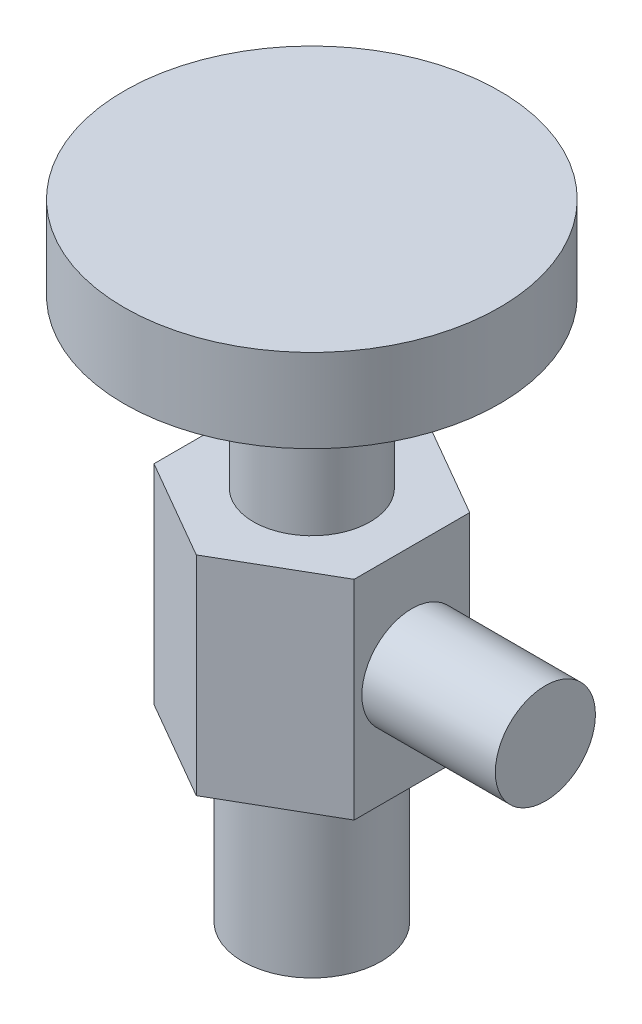
ISO-10303-21;
HEADER;
FILE_DESCRIPTION(('STEP AP214'),'2;1');
FILE_NAME('part.step','',(''),(''),'','','');
FILE_SCHEMA(('AUTOMOTIVE_DESIGN { 1 0 10303 214 1 1 1 1 }'));
ENDSEC;
DATA;
#1=APPLICATION_CONTEXT('core data for automotive mechanical design processes');
#2=APPLICATION_PROTOCOL_DEFINITION('international standard','automotive_design',2000,#1);
#3=PRODUCT_CONTEXT('',#1,'mechanical');
#4=PRODUCT('Part','Part','',(#3));
#5=PRODUCT_RELATED_PRODUCT_CATEGORY('part','',(#4));
#6=PRODUCT_DEFINITION_FORMATION('','',#4);
#7=PRODUCT_DEFINITION_CONTEXT('part definition',#1,'design');
#8=PRODUCT_DEFINITION('design','',#6,#7);
#9=PRODUCT_DEFINITION_SHAPE('','',#8);
#10=(LENGTH_UNIT() NAMED_UNIT(*) SI_UNIT(.MILLI.,.METRE.));
#11=(NAMED_UNIT(*) PLANE_ANGLE_UNIT() SI_UNIT($,.RADIAN.));
#12=(NAMED_UNIT(*) SI_UNIT($,.STERADIAN.) SOLID_ANGLE_UNIT());
#13=UNCERTAINTY_MEASURE_WITH_UNIT(LENGTH_MEASURE(1.E-05),#10,'distance_accuracy_value','');
#14=(GEOMETRIC_REPRESENTATION_CONTEXT(3) GLOBAL_UNCERTAINTY_ASSIGNED_CONTEXT((#13)) GLOBAL_UNIT_ASSIGNED_CONTEXT((#10,
#11,#12)) REPRESENTATION_CONTEXT('',''));
#15=CARTESIAN_POINT('',(0.,0.,0.));
#16=DIRECTION('',(0.,0.,1.));
#17=DIRECTION('',(1.,0.,0.));
#18=AXIS2_PLACEMENT_3D('',#15,#16,#17);
#19=CARTESIAN_POINT('',(0.,-20.,0.));
#20=DIRECTION('',(0.,1.,0.));
#21=DIRECTION('',(0.,0.,1.));
#22=AXIS2_PLACEMENT_3D('',#19,#20,#21);
#23=CYLINDRICAL_SURFACE('',#22,8.3);
#24=CARTESIAN_POINT('',(0.,-20.,0.));
#25=DIRECTION('',(0.,1.,0.));
#26=DIRECTION('',(0.,0.,1.));
#27=AXIS2_PLACEMENT_3D('',#24,#25,#26);
#28=CIRCLE('',#27,8.3);
#29=CARTESIAN_POINT('',(0.,-20.,8.3));
#30=VERTEX_POINT('',#29);
#31=EDGE_CURVE('E144',#30,#30,#28,.T.);
#32=ORIENTED_EDGE('',*,*,#31,.T.);
#33=EDGE_LOOP('',(#32));
#34=FACE_BOUND('',#33,.T.);
#35=CARTESIAN_POINT('',(0.,0.,0.));
#36=DIRECTION('',(0.,1.,0.));
#37=DIRECTION('',(0.,0.,1.));
#38=AXIS2_PLACEMENT_3D('',#35,#36,#37);
#39=CIRCLE('',#38,8.3);
#40=CARTESIAN_POINT('',(0.,0.,8.3));
#41=VERTEX_POINT('',#40);
#42=EDGE_CURVE('E145',#41,#41,#39,.T.);
#43=ORIENTED_EDGE('',*,*,#42,.F.);
#44=EDGE_LOOP('',(#43));
#45=FACE_BOUND('',#44,.T.);
#46=ADVANCED_FACE('F39',(#34,#45),#23,.T.);
#47=CARTESIAN_POINT('',(0.,-20.,0.));
#48=DIRECTION('',(0.,1.,0.));
#49=DIRECTION('',(0.,0.,1.));
#50=AXIS2_PLACEMENT_3D('',#47,#48,#49);
#51=PLANE('',#50);
#52=ORIENTED_EDGE('',*,*,#31,.F.);
#53=EDGE_LOOP('',(#52));
#54=FACE_BOUND('',#53,.T.);
#55=ADVANCED_FACE('F152',(#54),#51,.F.);
#56=CARTESIAN_POINT('',(11.9999999999999,25.,-6.92820323027565));
#57=DIRECTION('',(-0.499999999999995,0.,0.866025403784442));
#58=DIRECTION('',(0.866025403784442,0.,0.499999999999995));
#59=AXIS2_PLACEMENT_3D('',#56,#57,#58);
#60=PLANE('',#59);
#61=DIRECTION('',(-0.866025403784442,0.,-0.499999999999995));
#62=VECTOR('',#61,1.);
#63=CARTESIAN_POINT('',(11.9999999999999,0.,-6.92820323027565));
#64=LINE('',#63,#62);
#65=CARTESIAN_POINT('',(11.9999999999999,0.,-6.92820323027565));
#66=VERTEX_POINT('',#65);
#67=CARTESIAN_POINT('',(0.,0.,-13.856406460551));
#68=VERTEX_POINT('',#67);
#69=EDGE_CURVE('E121',#66,#68,#64,.T.);
#70=ORIENTED_EDGE('',*,*,#69,.T.);
#71=DIRECTION('',(0.,-1.,0.));
#72=VECTOR('',#71,1.);
#73=CARTESIAN_POINT('',(0.,25.,-13.856406460551));
#74=LINE('',#73,#72);
#75=CARTESIAN_POINT('',(0.,25.,-13.856406460551));
#76=VERTEX_POINT('',#75);
#77=EDGE_CURVE('E142',#76,#68,#74,.T.);
#78=ORIENTED_EDGE('',*,*,#77,.F.);
#79=DIRECTION('',(-0.866025403784442,0.,-0.499999999999995));
#80=VECTOR('',#79,1.);
#81=CARTESIAN_POINT('',(11.9999999999999,25.,-6.92820323027565));
#82=LINE('',#81,#80);
#83=CARTESIAN_POINT('',(11.9999999999999,25.,-6.92820323027565));
#84=VERTEX_POINT('',#83);
#85=EDGE_CURVE('E133',#84,#76,#82,.T.);
#86=ORIENTED_EDGE('',*,*,#85,.F.);
#87=DIRECTION('',(0.,-1.,0.));
#88=VECTOR('',#87,1.);
#89=CARTESIAN_POINT('',(11.9999999999999,25.,-6.92820323027565));
#90=LINE('',#89,#88);
#91=EDGE_CURVE('E118',#84,#66,#90,.T.);
#92=ORIENTED_EDGE('',*,*,#91,.T.);
#93=EDGE_LOOP('',(#70,#78,#86,#92));
#94=FACE_BOUND('',#93,.T.);
#95=ADVANCED_FACE('F157',(#94),#60,.F.);
#96=CARTESIAN_POINT('',(0.,25.,-13.856406460551));
#97=DIRECTION('',(0.500000000000001,0.,0.866025403784438));
#98=DIRECTION('',(0.866025403784438,0.,-0.500000000000001));
#99=AXIS2_PLACEMENT_3D('',#96,#97,#98);
#100=PLANE('',#99);
#101=DIRECTION('',(-0.866025403784438,0.,0.500000000000001));
#102=VECTOR('',#101,1.);
#103=CARTESIAN_POINT('',(0.,0.,-13.856406460551));
#104=LINE('',#103,#102);
#105=CARTESIAN_POINT('',(-12.,0.,-6.92820323027548));
#106=VERTEX_POINT('',#105);
#107=EDGE_CURVE('E130',#68,#106,#104,.T.);
#108=ORIENTED_EDGE('',*,*,#107,.T.);
#109=DIRECTION('',(0.,-1.,0.));
#110=VECTOR('',#109,1.);
#111=CARTESIAN_POINT('',(-12.,25.,-6.92820323027548));
#112=LINE('',#111,#110);
#113=CARTESIAN_POINT('',(-12.,25.,-6.92820323027548));
#114=VERTEX_POINT('',#113);
#115=EDGE_CURVE('E136',#114,#106,#112,.T.);
#116=ORIENTED_EDGE('',*,*,#115,.F.);
#117=DIRECTION('',(-0.866025403784438,0.,0.500000000000001));
#118=VECTOR('',#117,1.);
#119=CARTESIAN_POINT('',(0.,25.,-13.856406460551));
#120=LINE('',#119,#118);
#121=EDGE_CURVE('E91',#76,#114,#120,.T.);
#122=ORIENTED_EDGE('',*,*,#121,.F.);
#123=ORIENTED_EDGE('',*,*,#77,.T.);
#124=EDGE_LOOP('',(#108,#116,#122,#123));
#125=FACE_BOUND('',#124,.T.);
#126=ADVANCED_FACE('F164',(#125),#100,.F.);
#127=CARTESIAN_POINT('',(-12.,25.,-6.92820323027548));
#128=DIRECTION('',(1.,0.,0.));
#129=DIRECTION('',(0.,0.,-1.));
#130=AXIS2_PLACEMENT_3D('',#127,#128,#129);
#131=PLANE('',#130);
#132=DIRECTION('',(0.,0.,1.));
#133=VECTOR('',#132,1.);
#134=CARTESIAN_POINT('',(-12.,0.,-6.92820323027548));
#135=LINE('',#134,#133);
#136=CARTESIAN_POINT('',(-12.,0.,6.92820323027556));
#137=VERTEX_POINT('',#136);
#138=EDGE_CURVE('E128',#106,#137,#135,.T.);
#139=ORIENTED_EDGE('',*,*,#138,.T.);
#140=DIRECTION('',(0.,-1.,0.));
#141=VECTOR('',#140,1.);
#142=CARTESIAN_POINT('',(-12.,25.,6.92820323027556));
#143=LINE('',#142,#141);
#144=CARTESIAN_POINT('',(-12.,25.,6.92820323027556));
#145=VERTEX_POINT('',#144);
#146=EDGE_CURVE('E113',#145,#137,#143,.T.);
#147=ORIENTED_EDGE('',*,*,#146,.F.);
#148=DIRECTION('',(0.,0.,1.));
#149=VECTOR('',#148,1.);
#150=CARTESIAN_POINT('',(-12.,25.,-6.92820323027548));
#151=LINE('',#150,#149);
#152=EDGE_CURVE('E106',#114,#145,#151,.T.);
#153=ORIENTED_EDGE('',*,*,#152,.F.);
#154=ORIENTED_EDGE('',*,*,#115,.T.);
#155=EDGE_LOOP('',(#139,#147,#153,#154));
#156=FACE_BOUND('',#155,.T.);
#157=ADVANCED_FACE('F172',(#156),#131,.F.);
#158=CARTESIAN_POINT('',(-12.,25.,6.92820323027556));
#159=DIRECTION('',(0.499999999999995,0.,-0.866025403784442));
#160=DIRECTION('',(-0.866025403784442,0.,-0.499999999999995));
#161=AXIS2_PLACEMENT_3D('',#158,#159,#160);
#162=PLANE('',#161);
#163=DIRECTION('',(0.866025403784442,0.,0.499999999999995));
#164=VECTOR('',#163,1.);
#165=CARTESIAN_POINT('',(-12.,0.,6.92820323027556));
#166=LINE('',#165,#164);
#167=CARTESIAN_POINT('',(0.,0.,13.856406460551));
#168=VERTEX_POINT('',#167);
#169=EDGE_CURVE('E111',#137,#168,#166,.T.);
#170=ORIENTED_EDGE('',*,*,#169,.T.);
#171=DIRECTION('',(0.,-1.,0.));
#172=VECTOR('',#171,1.);
#173=CARTESIAN_POINT('',(0.,25.,13.856406460551));
#174=LINE('',#173,#172);
#175=CARTESIAN_POINT('',(0.,25.,13.856406460551));
#176=VERTEX_POINT('',#175);
#177=EDGE_CURVE('E112',#176,#168,#174,.T.);
#178=ORIENTED_EDGE('',*,*,#177,.F.);
#179=DIRECTION('',(0.866025403784442,0.,0.499999999999995));
#180=VECTOR('',#179,1.);
#181=CARTESIAN_POINT('',(-12.,25.,6.92820323027556));
#182=LINE('',#181,#180);
#183=EDGE_CURVE('E99',#145,#176,#182,.T.);
#184=ORIENTED_EDGE('',*,*,#183,.F.);
#185=ORIENTED_EDGE('',*,*,#146,.T.);
#186=EDGE_LOOP('',(#170,#178,#184,#185));
#187=FACE_BOUND('',#186,.T.);
#188=ADVANCED_FACE('F115',(#187),#162,.F.);
#189=CARTESIAN_POINT('',(0.,25.,13.856406460551));
#190=DIRECTION('',(-0.500000000000007,0.,-0.866025403784434));
#191=DIRECTION('',(-0.866025403784435,0.,0.500000000000007));
#192=AXIS2_PLACEMENT_3D('',#189,#190,#191);
#193=PLANE('',#192);
#194=DIRECTION('',(0.866025403784434,0.,-0.500000000000007));
#195=VECTOR('',#194,1.);
#196=CARTESIAN_POINT('',(0.,0.,13.856406460551));
#197=LINE('',#196,#195);
#198=CARTESIAN_POINT('',(12.0000000000001,0.,6.9282032302754));
#199=VERTEX_POINT('',#198);
#200=EDGE_CURVE('E79',#168,#199,#197,.T.);
#201=ORIENTED_EDGE('',*,*,#200,.T.);
#202=DIRECTION('',(0.,-1.,0.));
#203=VECTOR('',#202,1.);
#204=CARTESIAN_POINT('',(12.0000000000001,25.,6.9282032302754));
#205=LINE('',#204,#203);
#206=CARTESIAN_POINT('',(12.0000000000001,25.,6.9282032302754));
#207=VERTEX_POINT('',#206);
#208=EDGE_CURVE('E117',#207,#199,#205,.T.);
#209=ORIENTED_EDGE('',*,*,#208,.F.);
#210=DIRECTION('',(0.866025403784434,0.,-0.500000000000007));
#211=VECTOR('',#210,1.);
#212=CARTESIAN_POINT('',(0.,25.,13.856406460551));
#213=LINE('',#212,#211);
#214=EDGE_CURVE('E102',#176,#207,#213,.T.);
#215=ORIENTED_EDGE('',*,*,#214,.F.);
#216=ORIENTED_EDGE('',*,*,#177,.T.);
#217=EDGE_LOOP('',(#201,#209,#215,#216));
#218=FACE_BOUND('',#217,.T.);
#219=ADVANCED_FACE('F119',(#218),#193,.F.);
#220=CARTESIAN_POINT('',(12.0000000000001,25.,6.9282032302754));
#221=DIRECTION('',(-1.,0.,0.));
#222=DIRECTION('',(0.,0.,1.));
#223=AXIS2_PLACEMENT_3D('',#220,#221,#222);
#224=PLANE('',#223);
#225=CARTESIAN_POINT('',(12.,12.5,0.));
#226=DIRECTION('',(-1.,0.,0.));
#227=DIRECTION('',(0.,0.,1.));
#228=AXIS2_PLACEMENT_3D('',#225,#226,#227);
#229=CIRCLE('',#228,6.);
#230=CARTESIAN_POINT('',(12.0000000000001,12.5,6.));
#231=VERTEX_POINT('',#230);
#232=EDGE_CURVE('E11',#231,#231,#229,.F.);
#233=ORIENTED_EDGE('',*,*,#232,.F.);
#234=EDGE_LOOP('',(#233));
#235=FACE_BOUND('',#234,.T.);
#236=DIRECTION('',(0.,0.,-1.));
#237=VECTOR('',#236,1.);
#238=CARTESIAN_POINT('',(12.0000000000001,0.,6.9282032302754));
#239=LINE('',#238,#237);
#240=EDGE_CURVE('E81',#199,#66,#239,.T.);
#241=ORIENTED_EDGE('',*,*,#240,.T.);
#242=ORIENTED_EDGE('',*,*,#91,.F.);
#243=DIRECTION('',(0.,0.,-1.));
#244=VECTOR('',#243,1.);
#245=CARTESIAN_POINT('',(12.0000000000001,25.,6.9282032302754));
#246=LINE('',#245,#244);
#247=EDGE_CURVE('E54',#207,#84,#246,.T.);
#248=ORIENTED_EDGE('',*,*,#247,.F.);
#249=ORIENTED_EDGE('',*,*,#208,.T.);
#250=EDGE_LOOP('',(#241,#242,#248,#249));
#251=FACE_BOUND('',#250,.T.);
#252=ADVANCED_FACE('F176',(#235,#251),#224,.F.);
#253=CARTESIAN_POINT('',(0.,25.,0.));
#254=DIRECTION('',(0.,1.,0.));
#255=DIRECTION('',(0.,0.,1.));
#256=AXIS2_PLACEMENT_3D('',#253,#254,#255);
#257=PLANE('',#256);
#258=CARTESIAN_POINT('',(0.,25.,0.));
#259=DIRECTION('',(0.,1.,0.));
#260=DIRECTION('',(0.,0.,1.));
#261=AXIS2_PLACEMENT_3D('',#258,#259,#260);
#262=CIRCLE('',#261,7.);
#263=CARTESIAN_POINT('',(0.,25.,7.));
#264=VERTEX_POINT('',#263);
#265=EDGE_CURVE('E50',#264,#264,#262,.T.);
#266=ORIENTED_EDGE('',*,*,#265,.F.);
#267=EDGE_LOOP('',(#266));
#268=FACE_BOUND('',#267,.T.);
#269=ORIENTED_EDGE('',*,*,#85,.T.);
#270=ORIENTED_EDGE('',*,*,#121,.T.);
#271=ORIENTED_EDGE('',*,*,#152,.T.);
#272=ORIENTED_EDGE('',*,*,#183,.T.);
#273=ORIENTED_EDGE('',*,*,#214,.T.);
#274=ORIENTED_EDGE('',*,*,#247,.T.);
#275=EDGE_LOOP('',(#269,#270,#271,#272,#273,#274));
#276=FACE_BOUND('',#275,.T.);
#277=ADVANCED_FACE('F105',(#268,#276),#257,.T.);
#278=CARTESIAN_POINT('',(0.,0.,0.));
#279=DIRECTION('',(0.,1.,0.));
#280=DIRECTION('',(0.,0.,1.));
#281=AXIS2_PLACEMENT_3D('',#278,#279,#280);
#282=PLANE('',#281);
#283=ORIENTED_EDGE('',*,*,#42,.T.);
#284=EDGE_LOOP('',(#283));
#285=FACE_BOUND('',#284,.T.);
#286=ORIENTED_EDGE('',*,*,#69,.F.);
#287=ORIENTED_EDGE('',*,*,#240,.F.);
#288=ORIENTED_EDGE('',*,*,#200,.F.);
#289=ORIENTED_EDGE('',*,*,#169,.F.);
#290=ORIENTED_EDGE('',*,*,#138,.F.);
#291=ORIENTED_EDGE('',*,*,#107,.F.);
#292=EDGE_LOOP('',(#286,#287,#288,#289,#290,#291));
#293=FACE_BOUND('',#292,.T.);
#294=ADVANCED_FACE('F147',(#285,#293),#282,.F.);
#295=CARTESIAN_POINT('',(0.,45.,0.));
#296=DIRECTION('',(0.,-1.,0.));
#297=DIRECTION('',(0.,0.,-1.));
#298=AXIS2_PLACEMENT_3D('',#295,#296,#297);
#299=CYLINDRICAL_SURFACE('',#298,7.);
#300=CARTESIAN_POINT('',(0.,45.,0.));
#301=DIRECTION('',(0.,1.,0.));
#302=DIRECTION('',(0.,0.,1.));
#303=AXIS2_PLACEMENT_3D('',#300,#301,#302);
#304=CIRCLE('',#303,7.);
#305=CARTESIAN_POINT('',(0.,45.,7.));
#306=VERTEX_POINT('',#305);
#307=EDGE_CURVE('E126',#306,#306,#304,.T.);
#308=ORIENTED_EDGE('',*,*,#307,.F.);
#309=EDGE_LOOP('',(#308));
#310=FACE_BOUND('',#309,.T.);
#311=ORIENTED_EDGE('',*,*,#265,.T.);
#312=EDGE_LOOP('',(#311));
#313=FACE_BOUND('',#312,.T.);
#314=ADVANCED_FACE('F183',(#310,#313),#299,.T.);
#315=CARTESIAN_POINT('',(0.,55.,0.));
#316=DIRECTION('',(0.,-1.,0.));
#317=DIRECTION('',(0.,0.,-1.));
#318=AXIS2_PLACEMENT_3D('',#315,#316,#317);
#319=CYLINDRICAL_SURFACE('',#318,22.5);
#320=CARTESIAN_POINT('',(0.,55.,0.));
#321=DIRECTION('',(0.,1.,0.));
#322=DIRECTION('',(0.,0.,1.));
#323=AXIS2_PLACEMENT_3D('',#320,#321,#322);
#324=CIRCLE('',#323,22.5);
#325=CARTESIAN_POINT('',(0.,55.,22.5));
#326=VERTEX_POINT('',#325);
#327=EDGE_CURVE('E218',#326,#326,#324,.T.);
#328=ORIENTED_EDGE('',*,*,#327,.F.);
#329=EDGE_LOOP('',(#328));
#330=FACE_BOUND('',#329,.T.);
#331=CARTESIAN_POINT('',(0.,45.,0.));
#332=DIRECTION('',(0.,1.,0.));
#333=DIRECTION('',(0.,0.,1.));
#334=AXIS2_PLACEMENT_3D('',#331,#332,#333);
#335=CIRCLE('',#334,22.5);
#336=CARTESIAN_POINT('',(0.,45.,22.5));
#337=VERTEX_POINT('',#336);
#338=EDGE_CURVE('E216',#337,#337,#335,.T.);
#339=ORIENTED_EDGE('',*,*,#338,.T.);
#340=EDGE_LOOP('',(#339));
#341=FACE_BOUND('',#340,.T.);
#342=ADVANCED_FACE('F192',(#330,#341),#319,.T.);
#343=CARTESIAN_POINT('',(0.,55.,0.));
#344=DIRECTION('',(0.,1.,0.));
#345=DIRECTION('',(0.,0.,1.));
#346=AXIS2_PLACEMENT_3D('',#343,#344,#345);
#347=PLANE('',#346);
#348=ORIENTED_EDGE('',*,*,#327,.T.);
#349=EDGE_LOOP('',(#348));
#350=FACE_BOUND('',#349,.T.);
#351=ADVANCED_FACE('F193',(#350),#347,.T.);
#352=CARTESIAN_POINT('',(0.,45.,0.));
#353=DIRECTION('',(0.,1.,0.));
#354=DIRECTION('',(0.,0.,1.));
#355=AXIS2_PLACEMENT_3D('',#352,#353,#354);
#356=PLANE('',#355);
#357=ORIENTED_EDGE('',*,*,#307,.T.);
#358=EDGE_LOOP('',(#357));
#359=FACE_BOUND('',#358,.T.);
#360=ORIENTED_EDGE('',*,*,#338,.F.);
#361=EDGE_LOOP('',(#360));
#362=FACE_BOUND('',#361,.T.);
#363=ADVANCED_FACE('F197',(#359,#362),#356,.F.);
#364=CARTESIAN_POINT('',(28.,12.5,0.));
#365=DIRECTION('',(-1.,0.,0.));
#366=DIRECTION('',(0.,0.,1.));
#367=AXIS2_PLACEMENT_3D('',#364,#365,#366);
#368=CYLINDRICAL_SURFACE('',#367,6.);
#369=CARTESIAN_POINT('',(28.,12.5,0.));
#370=DIRECTION('',(1.,0.,0.));
#371=DIRECTION('',(0.,0.,-1.));
#372=AXIS2_PLACEMENT_3D('',#369,#370,#371);
#373=CIRCLE('',#372,6.);
#374=CARTESIAN_POINT('',(28.,12.5,-6.));
#375=VERTEX_POINT('',#374);
#376=EDGE_CURVE('E214',#375,#375,#373,.T.);
#377=ORIENTED_EDGE('',*,*,#376,.F.);
#378=EDGE_LOOP('',(#377));
#379=FACE_BOUND('',#378,.T.);
#380=ORIENTED_EDGE('',*,*,#232,.T.);
#381=EDGE_LOOP('',(#380));
#382=FACE_BOUND('',#381,.T.);
#383=ADVANCED_FACE('F199',(#379,#382),#368,.T.);
#384=CARTESIAN_POINT('',(28.,12.5,0.));
#385=DIRECTION('',(1.,0.,0.));
#386=DIRECTION('',(0.,0.,-1.));
#387=AXIS2_PLACEMENT_3D('',#384,#385,#386);
#388=PLANE('',#387);
#389=ORIENTED_EDGE('',*,*,#376,.T.);
#390=EDGE_LOOP('',(#389));
#391=FACE_BOUND('',#390,.T.);
#392=ADVANCED_FACE('F210',(#391),#388,.T.);
#393=CLOSED_SHELL('',(#46,#55,#95,#126,#157,#188,#219,#252,#277,#294,#314,#342,#351,#363,#383,#392));
#394=MANIFOLD_SOLID_BREP('B2',#393);
#395=ADVANCED_BREP_SHAPE_REPRESENTATION('',(#18,#394),#14);
#396=SHAPE_DEFINITION_REPRESENTATION(#9,#395);
ENDSEC;
END-ISO-10303-21;
